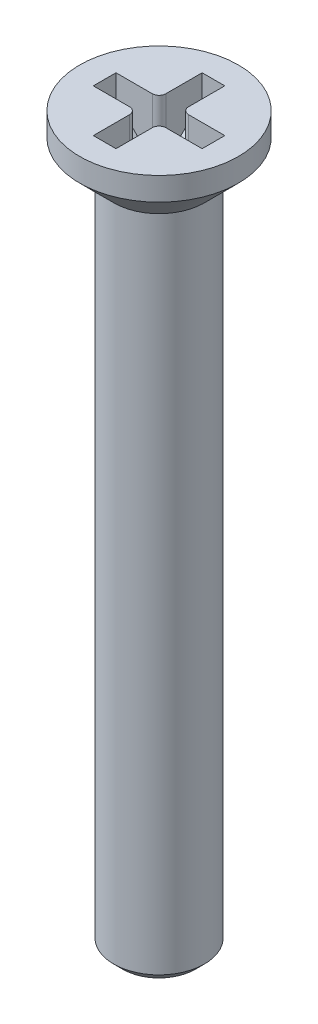
ISO-10303-21;
HEADER;
FILE_DESCRIPTION(('STEP AP214'),'2;1');
FILE_NAME('part.step','',(''),(''),'','','');
FILE_SCHEMA(('AUTOMOTIVE_DESIGN { 1 0 10303 214 1 1 1 1 }'));
ENDSEC;
DATA;
#1=APPLICATION_CONTEXT('core data for automotive mechanical design processes');
#2=APPLICATION_PROTOCOL_DEFINITION('international standard','automotive_design',2000,#1);
#3=PRODUCT_CONTEXT('',#1,'mechanical');
#4=PRODUCT('Part','Part','',(#3));
#5=PRODUCT_RELATED_PRODUCT_CATEGORY('part','',(#4));
#6=PRODUCT_DEFINITION_FORMATION('','',#4);
#7=PRODUCT_DEFINITION_CONTEXT('part definition',#1,'design');
#8=PRODUCT_DEFINITION('design','',#6,#7);
#9=PRODUCT_DEFINITION_SHAPE('','',#8);
#10=(LENGTH_UNIT() NAMED_UNIT(*) SI_UNIT(.MILLI.,.METRE.));
#11=(NAMED_UNIT(*) PLANE_ANGLE_UNIT() SI_UNIT($,.RADIAN.));
#12=(NAMED_UNIT(*) SI_UNIT($,.STERADIAN.) SOLID_ANGLE_UNIT());
#13=UNCERTAINTY_MEASURE_WITH_UNIT(LENGTH_MEASURE(1.E-05),#10,'distance_accuracy_value','');
#14=(GEOMETRIC_REPRESENTATION_CONTEXT(3) GLOBAL_UNCERTAINTY_ASSIGNED_CONTEXT((#13)) GLOBAL_UNIT_ASSIGNED_CONTEXT((#10,
#11,#12)) REPRESENTATION_CONTEXT('',''));
#15=CARTESIAN_POINT('',(0.,0.,0.));
#16=DIRECTION('',(0.,0.,1.));
#17=DIRECTION('',(1.,0.,0.));
#18=AXIS2_PLACEMENT_3D('',#15,#16,#17);
#19=CARTESIAN_POINT('',(0.,2.68965981119297,0.));
#20=DIRECTION('',(0.,-1.,0.));
#21=DIRECTION('',(0.,0.,-1.));
#22=AXIS2_PLACEMENT_3D('',#19,#20,#21);
#23=PLANE('',#22);
#24=DIRECTION('',(0.,0.,-1.));
#25=VECTOR('',#24,1.);
#26=CARTESIAN_POINT('',(0.25,2.68965981119297,-1.2));
#27=LINE('',#26,#25);
#28=CARTESIAN_POINT('',(0.25,2.68965981119297,-0.399999999999998));
#29=VERTEX_POINT('',#28);
#30=CARTESIAN_POINT('',(0.25,2.68965981119297,-1.2));
#31=VERTEX_POINT('',#30);
#32=EDGE_CURVE('E279',#29,#31,#27,.T.);
#33=ORIENTED_EDGE('',*,*,#32,.F.);
#34=CARTESIAN_POINT('',(0.4,2.68965981119297,-0.399999999999999));
#35=DIRECTION('',(0.,-1.,0.));
#36=DIRECTION('',(0.,0.,-1.));
#37=AXIS2_PLACEMENT_3D('',#34,#35,#36);
#38=CIRCLE('',#37,0.15);
#39=CARTESIAN_POINT('',(0.4,2.68965981119297,-0.249999999999999));
#40=VERTEX_POINT('',#39);
#41=EDGE_CURVE('E311',#29,#40,#38,.F.);
#42=ORIENTED_EDGE('',*,*,#41,.T.);
#43=DIRECTION('',(-1.,0.,0.));
#44=VECTOR('',#43,1.);
#45=CARTESIAN_POINT('',(1.2,2.68965981119297,-0.249999999999996));
#46=LINE('',#45,#44);
#47=CARTESIAN_POINT('',(1.2,2.68965981119297,-0.249999999999996));
#48=VERTEX_POINT('',#47);
#49=EDGE_CURVE('E249',#48,#40,#46,.T.);
#50=ORIENTED_EDGE('',*,*,#49,.F.);
#51=DIRECTION('',(0.,0.,-1.));
#52=VECTOR('',#51,1.);
#53=CARTESIAN_POINT('',(1.2,2.68965981119297,0.250000000000004));
#54=LINE('',#53,#52);
#55=CARTESIAN_POINT('',(1.2,2.68965981119297,0.250000000000004));
#56=VERTEX_POINT('',#55);
#57=EDGE_CURVE('E248',#56,#48,#54,.T.);
#58=ORIENTED_EDGE('',*,*,#57,.F.);
#59=DIRECTION('',(1.,0.,0.));
#60=VECTOR('',#59,1.);
#61=CARTESIAN_POINT('',(1.2,2.68965981119297,0.250000000000004));
#62=LINE('',#61,#60);
#63=CARTESIAN_POINT('',(0.4,2.68965981119297,0.250000000000001));
#64=VERTEX_POINT('',#63);
#65=EDGE_CURVE('E252',#64,#56,#62,.T.);
#66=ORIENTED_EDGE('',*,*,#65,.F.);
#67=CARTESIAN_POINT('',(0.4,2.68965981119297,0.400000000000001));
#68=DIRECTION('',(0.,-1.,0.));
#69=DIRECTION('',(0.,0.,-1.));
#70=AXIS2_PLACEMENT_3D('',#67,#68,#69);
#71=CIRCLE('',#70,0.15);
#72=CARTESIAN_POINT('',(0.25,2.68965981119297,0.400000000000001));
#73=VERTEX_POINT('',#72);
#74=EDGE_CURVE('E309',#64,#73,#71,.F.);
#75=ORIENTED_EDGE('',*,*,#74,.T.);
#76=DIRECTION('',(0.,0.,-1.));
#77=VECTOR('',#76,1.);
#78=CARTESIAN_POINT('',(0.25,2.68965981119297,1.2));
#79=LINE('',#78,#77);
#80=CARTESIAN_POINT('',(0.25,2.68965981119297,1.2));
#81=VERTEX_POINT('',#80);
#82=EDGE_CURVE('E226',#81,#73,#79,.T.);
#83=ORIENTED_EDGE('',*,*,#82,.F.);
#84=DIRECTION('',(1.,0.,0.));
#85=VECTOR('',#84,1.);
#86=CARTESIAN_POINT('',(-0.25,2.68965981119297,1.2));
#87=LINE('',#86,#85);
#88=CARTESIAN_POINT('',(-0.25,2.68965981119297,1.2));
#89=VERTEX_POINT('',#88);
#90=EDGE_CURVE('E232',#89,#81,#87,.T.);
#91=ORIENTED_EDGE('',*,*,#90,.F.);
#92=DIRECTION('',(0.,0.,1.));
#93=VECTOR('',#92,1.);
#94=CARTESIAN_POINT('',(-0.25,2.68965981119297,1.2));
#95=LINE('',#94,#93);
#96=CARTESIAN_POINT('',(-0.25,2.68965981119297,0.399999999999996));
#97=VERTEX_POINT('',#96);
#98=EDGE_CURVE('E235',#97,#89,#95,.T.);
#99=ORIENTED_EDGE('',*,*,#98,.F.);
#100=CARTESIAN_POINT('',(-0.4,2.68965981119297,0.399999999999996));
#101=DIRECTION('',(0.,-1.,0.));
#102=DIRECTION('',(0.,0.,-1.));
#103=AXIS2_PLACEMENT_3D('',#100,#101,#102);
#104=CIRCLE('',#103,0.15);
#105=CARTESIAN_POINT('',(-0.399999999999998,2.68965981119297,0.249999999999996));
#106=VERTEX_POINT('',#105);
#107=EDGE_CURVE('E305',#97,#106,#104,.F.);
#108=ORIENTED_EDGE('',*,*,#107,.T.);
#109=DIRECTION('',(1.,0.,0.));
#110=VECTOR('',#109,1.);
#111=CARTESIAN_POINT('',(-1.2,2.68965981119297,0.249999999999988));
#112=LINE('',#111,#110);
#113=CARTESIAN_POINT('',(-1.2,2.68965981119297,0.249999999999988));
#114=VERTEX_POINT('',#113);
#115=EDGE_CURVE('E217',#114,#106,#112,.T.);
#116=ORIENTED_EDGE('',*,*,#115,.F.);
#117=DIRECTION('',(0.,0.,1.));
#118=VECTOR('',#117,1.);
#119=CARTESIAN_POINT('',(-1.2,2.68965981119297,-0.250000000000012));
#120=LINE('',#119,#118);
#121=CARTESIAN_POINT('',(-1.2,2.68965981119297,-0.250000000000012));
#122=VERTEX_POINT('',#121);
#123=EDGE_CURVE('E220',#122,#114,#120,.T.);
#124=ORIENTED_EDGE('',*,*,#123,.F.);
#125=CARTESIAN_POINT('',(-0.4,2.68965981119297,-0.250000000000001));
#126=VERTEX_POINT('',#125);
#127=EDGE_CURVE('E241',#126,#122,#46,.T.);
#128=ORIENTED_EDGE('',*,*,#127,.F.);
#129=CARTESIAN_POINT('',(-0.4,2.68965981119297,-0.400000000000001));
#130=DIRECTION('',(0.,-1.,0.));
#131=DIRECTION('',(0.,0.,-1.));
#132=AXIS2_PLACEMENT_3D('',#129,#130,#131);
#133=CIRCLE('',#132,0.15);
#134=CARTESIAN_POINT('',(-0.25,2.68965981119297,-0.400000000000001));
#135=VERTEX_POINT('',#134);
#136=EDGE_CURVE('E307',#126,#135,#133,.F.);
#137=ORIENTED_EDGE('',*,*,#136,.T.);
#138=DIRECTION('',(0.,0.,1.));
#139=VECTOR('',#138,1.);
#140=CARTESIAN_POINT('',(-0.25,2.68965981119297,-1.2));
#141=LINE('',#140,#139);
#142=CARTESIAN_POINT('',(-0.25,2.68965981119297,-1.2));
#143=VERTEX_POINT('',#142);
#144=EDGE_CURVE('E271',#143,#135,#141,.T.);
#145=ORIENTED_EDGE('',*,*,#144,.F.);
#146=DIRECTION('',(-1.,0.,0.));
#147=VECTOR('',#146,1.);
#148=CARTESIAN_POINT('',(0.25,2.68965981119297,-1.2));
#149=LINE('',#148,#147);
#150=EDGE_CURVE('E276',#31,#143,#149,.T.);
#151=ORIENTED_EDGE('',*,*,#150,.F.);
#152=EDGE_LOOP('',(#33,#42,#50,#58,#66,#75,#83,#91,#99,#108,#116,#124,#128,#137,#145,#151));
#153=FACE_BOUND('',#152,.T.);
#154=CARTESIAN_POINT('',(0.,2.68965981119297,0.));
#155=DIRECTION('',(0.,-1.,0.));
#156=DIRECTION('',(0.,0.,-1.));
#157=AXIS2_PLACEMENT_3D('',#154,#155,#156);
#158=CIRCLE('',#157,1.75);
#159=CARTESIAN_POINT('',(0.,2.68965981119297,-1.75));
#160=VERTEX_POINT('',#159);
#161=EDGE_CURVE('E299',#160,#160,#158,.T.);
#162=ORIENTED_EDGE('',*,*,#161,.F.);
#163=EDGE_LOOP('',(#162));
#164=FACE_BOUND('',#163,.T.);
#165=ADVANCED_FACE('F35',(#153,#164),#23,.F.);
#166=CARTESIAN_POINT('',(0.,-3.76919896922529,0.));
#167=DIRECTION('',(0.,-1.,0.));
#168=DIRECTION('',(0.,0.,-1.));
#169=AXIS2_PLACEMENT_3D('',#166,#167,#168);
#170=CYLINDRICAL_SURFACE('',#169,1.75);
#171=CARTESIAN_POINT('',(0.,2.17965981119297,0.));
#172=DIRECTION('',(0.,-1.,0.));
#173=DIRECTION('',(0.,0.,-1.));
#174=AXIS2_PLACEMENT_3D('',#171,#172,#173);
#175=CIRCLE('',#174,1.75);
#176=CARTESIAN_POINT('',(0.,2.17965981119297,-1.75));
#177=VERTEX_POINT('',#176);
#178=EDGE_CURVE('E296',#177,#177,#175,.T.);
#179=ORIENTED_EDGE('',*,*,#178,.F.);
#180=EDGE_LOOP('',(#179));
#181=FACE_BOUND('',#180,.T.);
#182=ORIENTED_EDGE('',*,*,#161,.T.);
#183=EDGE_LOOP('',(#182));
#184=FACE_BOUND('',#183,.T.);
#185=ADVANCED_FACE('F373',(#181,#184),#170,.T.);
#186=CARTESIAN_POINT('',(0.,2.17965981119297,0.));
#187=DIRECTION('',(0.,1.,0.));
#188=DIRECTION('',(0.,0.,1.));
#189=AXIS2_PLACEMENT_3D('',#186,#187,#188);
#190=CONICAL_SURFACE('',#189,1.75,0.785398163397451);
#191=CARTESIAN_POINT('',(0.,1.42965981119297,0.));
#192=DIRECTION('',(0.,-1.,0.));
#193=DIRECTION('',(0.,0.,-1.));
#194=AXIS2_PLACEMENT_3D('',#191,#192,#193);
#195=CIRCLE('',#194,1.);
#196=CARTESIAN_POINT('',(0.,1.42965981119297,-1.));
#197=VERTEX_POINT('',#196);
#198=EDGE_CURVE('E293',#197,#197,#195,.T.);
#199=ORIENTED_EDGE('',*,*,#198,.F.);
#200=EDGE_LOOP('',(#199));
#201=FACE_BOUND('',#200,.T.);
#202=ORIENTED_EDGE('',*,*,#178,.T.);
#203=EDGE_LOOP('',(#202));
#204=FACE_BOUND('',#203,.T.);
#205=ADVANCED_FACE('F378',(#201,#204),#190,.T.);
#206=CARTESIAN_POINT('',(0.,-3.76919896922529,0.));
#207=DIRECTION('',(0.,-1.,0.));
#208=DIRECTION('',(0.,0.,-1.));
#209=AXIS2_PLACEMENT_3D('',#206,#207,#208);
#210=CYLINDRICAL_SURFACE('',#209,0.999999999999999);
#211=CARTESIAN_POINT('',(0.,-13.110340188807,0.));
#212=DIRECTION('',(0.,-1.,0.));
#213=DIRECTION('',(0.,0.,-1.));
#214=AXIS2_PLACEMENT_3D('',#211,#212,#213);
#215=CIRCLE('',#214,0.999999999999998);
#216=CARTESIAN_POINT('',(0.,-13.110340188807,-0.999999999999998));
#217=VERTEX_POINT('',#216);
#218=EDGE_CURVE('E290',#217,#217,#215,.T.);
#219=ORIENTED_EDGE('',*,*,#218,.F.);
#220=EDGE_LOOP('',(#219));
#221=FACE_BOUND('',#220,.T.);
#222=ORIENTED_EDGE('',*,*,#198,.T.);
#223=EDGE_LOOP('',(#222));
#224=FACE_BOUND('',#223,.T.);
#225=ADVANCED_FACE('F558',(#221,#224),#210,.T.);
#226=CARTESIAN_POINT('',(0.,-13.110340188807,0.));
#227=DIRECTION('',(0.,1.,0.));
#228=DIRECTION('',(0.,0.,1.));
#229=AXIS2_PLACEMENT_3D('',#226,#227,#228);
#230=CONICAL_SURFACE('',#229,0.999999999999998,0.785398163397447);
#231=CARTESIAN_POINT('',(0.,-13.310340188807,0.));
#232=DIRECTION('',(0.,-1.,0.));
#233=DIRECTION('',(0.,0.,-1.));
#234=AXIS2_PLACEMENT_3D('',#231,#232,#233);
#235=CIRCLE('',#234,0.8);
#236=CARTESIAN_POINT('',(0.,-13.310340188807,-0.8));
#237=VERTEX_POINT('',#236);
#238=EDGE_CURVE('E285',#237,#237,#235,.T.);
#239=ORIENTED_EDGE('',*,*,#238,.F.);
#240=EDGE_LOOP('',(#239));
#241=FACE_BOUND('',#240,.T.);
#242=ORIENTED_EDGE('',*,*,#218,.T.);
#243=EDGE_LOOP('',(#242));
#244=FACE_BOUND('',#243,.T.);
#245=ADVANCED_FACE('F566',(#241,#244),#230,.T.);
#246=CARTESIAN_POINT('',(-0.8,-13.310340188807,0.));
#247=DIRECTION('',(0.,1.,0.));
#248=DIRECTION('',(0.,0.,1.));
#249=AXIS2_PLACEMENT_3D('',#246,#247,#248);
#250=PLANE('',#249);
#251=ORIENTED_EDGE('',*,*,#238,.T.);
#252=EDGE_LOOP('',(#251));
#253=FACE_BOUND('',#252,.T.);
#254=ADVANCED_FACE('F535',(#253),#250,.F.);
#255=CARTESIAN_POINT('',(-0.25,2.18965981119297,-1.2));
#256=DIRECTION('',(-1.,0.,0.));
#257=DIRECTION('',(0.,0.,1.));
#258=AXIS2_PLACEMENT_3D('',#255,#256,#257);
#259=PLANE('',#258);
#260=ORIENTED_EDGE('',*,*,#144,.T.);
#261=DIRECTION('',(0.,-1.,0.));
#262=VECTOR('',#261,1.);
#263=CARTESIAN_POINT('',(-0.25,2.18965981119297,-0.400000000000001));
#264=LINE('',#263,#262);
#265=CARTESIAN_POINT('',(-0.25,1.42965981119297,-0.400000000000001));
#266=VERTEX_POINT('',#265);
#267=EDGE_CURVE('E320',#135,#266,#264,.T.);
#268=ORIENTED_EDGE('',*,*,#267,.T.);
#269=DIRECTION('',(0.,0.,-1.));
#270=VECTOR('',#269,1.);
#271=CARTESIAN_POINT('',(-0.25,1.42965981119297,0.));
#272=LINE('',#271,#270);
#273=CARTESIAN_POINT('',(-0.25,1.42965981119297,-0.439999999999998));
#274=VERTEX_POINT('',#273);
#275=EDGE_CURVE('E258',#266,#274,#272,.T.);
#276=ORIENTED_EDGE('',*,*,#275,.T.);
#277=DIRECTION('',(0.,0.707106781186547,-0.707106781186548));
#278=VECTOR('',#277,1.);
#279=CARTESIAN_POINT('',(-0.25,1.42965981119297,-0.439999999999998));
#280=LINE('',#279,#278);
#281=CARTESIAN_POINT('',(-0.25,2.18965981119297,-1.2));
#282=VERTEX_POINT('',#281);
#283=EDGE_CURVE('E264',#274,#282,#280,.T.);
#284=ORIENTED_EDGE('',*,*,#283,.T.);
#285=DIRECTION('',(0.,1.,0.));
#286=VECTOR('',#285,1.);
#287=CARTESIAN_POINT('',(-0.25,2.18965981119297,-1.2));
#288=LINE('',#287,#286);
#289=EDGE_CURVE('E283',#282,#143,#288,.T.);
#290=ORIENTED_EDGE('',*,*,#289,.T.);
#291=EDGE_LOOP('',(#260,#268,#276,#284,#290));
#292=FACE_BOUND('',#291,.T.);
#293=ADVANCED_FACE('F532',(#292),#259,.F.);
#294=CARTESIAN_POINT('',(0.25,2.18965981119297,-1.2));
#295=DIRECTION('',(0.,0.,-1.));
#296=DIRECTION('',(-1.,0.,0.));
#297=AXIS2_PLACEMENT_3D('',#294,#295,#296);
#298=PLANE('',#297);
#299=ORIENTED_EDGE('',*,*,#150,.T.);
#300=ORIENTED_EDGE('',*,*,#289,.F.);
#301=DIRECTION('',(-1.,0.,0.));
#302=VECTOR('',#301,1.);
#303=CARTESIAN_POINT('',(0.25,2.18965981119297,-1.2));
#304=LINE('',#303,#302);
#305=CARTESIAN_POINT('',(0.25,2.18965981119297,-1.2));
#306=VERTEX_POINT('',#305);
#307=EDGE_CURVE('E272',#306,#282,#304,.T.);
#308=ORIENTED_EDGE('',*,*,#307,.F.);
#309=DIRECTION('',(0.,1.,0.));
#310=VECTOR('',#309,1.);
#311=CARTESIAN_POINT('',(0.25,2.18965981119297,-1.2));
#312=LINE('',#311,#310);
#313=EDGE_CURVE('E275',#306,#31,#312,.T.);
#314=ORIENTED_EDGE('',*,*,#313,.T.);
#315=EDGE_LOOP('',(#299,#300,#308,#314));
#316=FACE_BOUND('',#315,.T.);
#317=ADVANCED_FACE('F522',(#316),#298,.F.);
#318=CARTESIAN_POINT('',(0.25,2.18965981119297,-1.2));
#319=DIRECTION('',(1.,0.,0.));
#320=DIRECTION('',(0.,0.,-1.));
#321=AXIS2_PLACEMENT_3D('',#318,#319,#320);
#322=PLANE('',#321);
#323=DIRECTION('',(0.,0.,-1.));
#324=VECTOR('',#323,1.);
#325=CARTESIAN_POINT('',(0.25,1.42965981119297,0.));
#326=LINE('',#325,#324);
#327=CARTESIAN_POINT('',(0.25,1.42965981119297,-0.399999999999999));
#328=VERTEX_POINT('',#327);
#329=CARTESIAN_POINT('',(0.25,1.42965981119297,-0.439999999999998));
#330=VERTEX_POINT('',#329);
#331=EDGE_CURVE('E261',#328,#330,#326,.T.);
#332=ORIENTED_EDGE('',*,*,#331,.F.);
#333=DIRECTION('',(0.,1.,0.));
#334=VECTOR('',#333,1.);
#335=CARTESIAN_POINT('',(0.25,2.18965981119297,-0.399999999999998));
#336=LINE('',#335,#334);
#337=EDGE_CURVE('E302',#328,#29,#336,.T.);
#338=ORIENTED_EDGE('',*,*,#337,.T.);
#339=ORIENTED_EDGE('',*,*,#32,.T.);
#340=ORIENTED_EDGE('',*,*,#313,.F.);
#341=DIRECTION('',(0.,0.707106781186547,-0.707106781186548));
#342=VECTOR('',#341,1.);
#343=CARTESIAN_POINT('',(0.25,1.42965981119297,-0.439999999999998));
#344=LINE('',#343,#342);
#345=EDGE_CURVE('E263',#330,#306,#344,.T.);
#346=ORIENTED_EDGE('',*,*,#345,.F.);
#347=EDGE_LOOP('',(#332,#338,#339,#340,#346));
#348=FACE_BOUND('',#347,.T.);
#349=ADVANCED_FACE('F512',(#348),#322,.F.);
#350=CARTESIAN_POINT('',(0.25,1.42965981119297,0.));
#351=DIRECTION('',(0.,1.,0.));
#352=DIRECTION('',(0.,0.,1.));
#353=AXIS2_PLACEMENT_3D('',#350,#351,#352);
#354=PLANE('',#353);
#355=ORIENTED_EDGE('',*,*,#275,.F.);
#356=CARTESIAN_POINT('',(-0.4,1.42965981119297,-0.400000000000001));
#357=DIRECTION('',(0.,1.,0.));
#358=DIRECTION('',(0.,0.,1.));
#359=AXIS2_PLACEMENT_3D('',#356,#357,#358);
#360=CIRCLE('',#359,0.15);
#361=CARTESIAN_POINT('',(-0.4,1.42965981119297,-0.250000000000001));
#362=VERTEX_POINT('',#361);
#363=EDGE_CURVE('E43',#266,#362,#360,.F.);
#364=ORIENTED_EDGE('',*,*,#363,.T.);
#365=DIRECTION('',(1.,0.,0.));
#366=VECTOR('',#365,1.);
#367=CARTESIAN_POINT('',(0.,1.42965981119297,-0.25));
#368=LINE('',#367,#366);
#369=CARTESIAN_POINT('',(-0.439999999999996,1.42965981119297,-0.250000000000005));
#370=VERTEX_POINT('',#369);
#371=EDGE_CURVE('E170',#370,#362,#368,.T.);
#372=ORIENTED_EDGE('',*,*,#371,.F.);
#373=DIRECTION('',(0.,0.,1.));
#374=VECTOR('',#373,1.);
#375=CARTESIAN_POINT('',(-0.439999999999996,1.42965981119297,-0.250000000000005));
#376=LINE('',#375,#374);
#377=CARTESIAN_POINT('',(-0.440000000000001,1.42965981119297,0.249999999999995));
#378=VERTEX_POINT('',#377);
#379=EDGE_CURVE('E174',#370,#378,#376,.T.);
#380=ORIENTED_EDGE('',*,*,#379,.T.);
#381=DIRECTION('',(-1.,0.,0.));
#382=VECTOR('',#381,1.);
#383=CARTESIAN_POINT('',(0.,1.42965981119297,0.25));
#384=LINE('',#383,#382);
#385=CARTESIAN_POINT('',(-0.399999999999999,1.42965981119297,0.249999999999996));
#386=VERTEX_POINT('',#385);
#387=EDGE_CURVE('E195',#386,#378,#384,.T.);
#388=ORIENTED_EDGE('',*,*,#387,.F.);
#389=CARTESIAN_POINT('',(-0.4,1.42965981119297,0.399999999999996));
#390=DIRECTION('',(0.,1.,0.));
#391=DIRECTION('',(0.,0.,1.));
#392=AXIS2_PLACEMENT_3D('',#389,#390,#391);
#393=CIRCLE('',#392,0.15);
#394=CARTESIAN_POINT('',(-0.25,1.42965981119297,0.399999999999996));
#395=VERTEX_POINT('',#394);
#396=EDGE_CURVE('E11',#386,#395,#393,.F.);
#397=ORIENTED_EDGE('',*,*,#396,.T.);
#398=DIRECTION('',(0.,0.,1.));
#399=VECTOR('',#398,1.);
#400=CARTESIAN_POINT('',(-0.25,1.42965981119297,0.));
#401=LINE('',#400,#399);
#402=CARTESIAN_POINT('',(-0.25,1.42965981119297,0.439999999999998));
#403=VERTEX_POINT('',#402);
#404=EDGE_CURVE('E199',#395,#403,#401,.T.);
#405=ORIENTED_EDGE('',*,*,#404,.T.);
#406=DIRECTION('',(1.,0.,0.));
#407=VECTOR('',#406,1.);
#408=CARTESIAN_POINT('',(-0.25,1.42965981119297,0.439999999999998));
#409=LINE('',#408,#407);
#410=CARTESIAN_POINT('',(0.25,1.42965981119297,0.439999999999998));
#411=VERTEX_POINT('',#410);
#412=EDGE_CURVE('E204',#403,#411,#409,.T.);
#413=ORIENTED_EDGE('',*,*,#412,.T.);
#414=DIRECTION('',(0.,0.,1.));
#415=VECTOR('',#414,1.);
#416=CARTESIAN_POINT('',(0.25,1.42965981119297,0.));
#417=LINE('',#416,#415);
#418=CARTESIAN_POINT('',(0.25,1.42965981119297,0.400000000000001));
#419=VERTEX_POINT('',#418);
#420=EDGE_CURVE('E188',#419,#411,#417,.T.);
#421=ORIENTED_EDGE('',*,*,#420,.F.);
#422=CARTESIAN_POINT('',(0.4,1.42965981119297,0.400000000000001));
#423=DIRECTION('',(0.,1.,0.));
#424=DIRECTION('',(0.,0.,1.));
#425=AXIS2_PLACEMENT_3D('',#422,#423,#424);
#426=CIRCLE('',#425,0.15);
#427=CARTESIAN_POINT('',(0.4,1.42965981119297,0.250000000000001));
#428=VERTEX_POINT('',#427);
#429=EDGE_CURVE('E331',#419,#428,#426,.F.);
#430=ORIENTED_EDGE('',*,*,#429,.T.);
#431=DIRECTION('',(1.,0.,0.));
#432=VECTOR('',#431,1.);
#433=CARTESIAN_POINT('',(0.,1.42965981119297,0.25));
#434=LINE('',#433,#432);
#435=CARTESIAN_POINT('',(0.439999999999997,1.42965981119297,0.250000000000001));
#436=VERTEX_POINT('',#435);
#437=EDGE_CURVE('E209',#428,#436,#434,.T.);
#438=ORIENTED_EDGE('',*,*,#437,.T.);
#439=DIRECTION('',(0.,0.,-1.));
#440=VECTOR('',#439,1.);
#441=CARTESIAN_POINT('',(0.439999999999997,1.42965981119297,0.250000000000001));
#442=LINE('',#441,#440);
#443=CARTESIAN_POINT('',(0.439999999999999,1.42965981119297,-0.249999999999999));
#444=VERTEX_POINT('',#443);
#445=EDGE_CURVE('E212',#436,#444,#442,.T.);
#446=ORIENTED_EDGE('',*,*,#445,.T.);
#447=CARTESIAN_POINT('',(0.4,1.42965981119297,-0.249999999999999));
#448=VERTEX_POINT('',#447);
#449=EDGE_CURVE('E180',#448,#444,#368,.T.);
#450=ORIENTED_EDGE('',*,*,#449,.F.);
#451=CARTESIAN_POINT('',(0.4,1.42965981119297,-0.399999999999999));
#452=DIRECTION('',(0.,1.,0.));
#453=DIRECTION('',(0.,0.,1.));
#454=AXIS2_PLACEMENT_3D('',#451,#452,#453);
#455=CIRCLE('',#454,0.15);
#456=EDGE_CURVE('E329',#448,#328,#455,.F.);
#457=ORIENTED_EDGE('',*,*,#456,.T.);
#458=ORIENTED_EDGE('',*,*,#331,.T.);
#459=DIRECTION('',(-1.,0.,0.));
#460=VECTOR('',#459,1.);
#461=CARTESIAN_POINT('',(0.25,1.42965981119297,-0.439999999999998));
#462=LINE('',#461,#460);
#463=EDGE_CURVE('E266',#330,#274,#462,.T.);
#464=ORIENTED_EDGE('',*,*,#463,.T.);
#465=EDGE_LOOP('',(#355,#364,#372,#380,#388,#397,#405,#413,#421,#430,#438,#446,#450,#457,#458,#464));
#466=FACE_BOUND('',#465,.T.);
#467=ADVANCED_FACE('F173',(#466),#354,.T.);
#468=CARTESIAN_POINT('',(0.25,1.42965981119297,-0.439999999999998));
#469=DIRECTION('',(0.,0.707106781186548,0.707106781186547));
#470=DIRECTION('',(0.,-0.707106781186547,0.707106781186548));
#471=AXIS2_PLACEMENT_3D('',#468,#469,#470);
#472=PLANE('',#471);
#473=ORIENTED_EDGE('',*,*,#283,.F.);
#474=ORIENTED_EDGE('',*,*,#463,.F.);
#475=ORIENTED_EDGE('',*,*,#345,.T.);
#476=ORIENTED_EDGE('',*,*,#307,.T.);
#477=EDGE_LOOP('',(#473,#474,#475,#476));
#478=FACE_BOUND('',#477,.T.);
#479=ADVANCED_FACE('F502',(#478),#472,.T.);
#480=CARTESIAN_POINT('',(1.2,2.18965981119297,-0.249999999999996));
#481=DIRECTION('',(0.,0.,-1.));
#482=DIRECTION('',(-1.,0.,0.));
#483=AXIS2_PLACEMENT_3D('',#480,#481,#482);
#484=PLANE('',#483);
#485=ORIENTED_EDGE('',*,*,#371,.T.);
#486=DIRECTION('',(0.,-1.,0.));
#487=VECTOR('',#486,1.);
#488=CARTESIAN_POINT('',(-0.4,2.18965981119297,-0.250000000000001));
#489=LINE('',#488,#487);
#490=EDGE_CURVE('E323',#362,#126,#489,.F.);
#491=ORIENTED_EDGE('',*,*,#490,.T.);
#492=ORIENTED_EDGE('',*,*,#127,.T.);
#493=DIRECTION('',(0.,1.,0.));
#494=VECTOR('',#493,1.);
#495=CARTESIAN_POINT('',(-1.2,2.18965981119297,-0.250000000000012));
#496=LINE('',#495,#494);
#497=CARTESIAN_POINT('',(-1.2,2.18965981119297,-0.250000000000012));
#498=VERTEX_POINT('',#497);
#499=EDGE_CURVE('E192',#498,#122,#496,.T.);
#500=ORIENTED_EDGE('',*,*,#499,.F.);
#501=DIRECTION('',(-0.707106781186548,0.707106781186547,0.));
#502=VECTOR('',#501,1.);
#503=CARTESIAN_POINT('',(-0.439999999999996,1.42965981119297,-0.250000000000005));
#504=LINE('',#503,#502);
#505=EDGE_CURVE('E185',#370,#498,#504,.T.);
#506=ORIENTED_EDGE('',*,*,#505,.F.);
#507=EDGE_LOOP('',(#485,#491,#492,#500,#506));
#508=FACE_BOUND('',#507,.T.);
#509=ADVANCED_FACE('F190',(#508),#484,.F.);
#510=ORIENTED_EDGE('',*,*,#49,.T.);
#511=DIRECTION('',(0.,1.,0.));
#512=VECTOR('',#511,1.);
#513=CARTESIAN_POINT('',(0.4,2.18965981119297,-0.249999999999999));
#514=LINE('',#513,#512);
#515=EDGE_CURVE('E313',#40,#448,#514,.F.);
#516=ORIENTED_EDGE('',*,*,#515,.T.);
#517=ORIENTED_EDGE('',*,*,#449,.T.);
#518=DIRECTION('',(0.707106781186548,0.707106781186547,0.));
#519=VECTOR('',#518,1.);
#520=CARTESIAN_POINT('',(0.439999999999999,1.42965981119297,-0.249999999999999));
#521=LINE('',#520,#519);
#522=CARTESIAN_POINT('',(1.2,2.18965981119297,-0.249999999999996));
#523=VERTEX_POINT('',#522);
#524=EDGE_CURVE('E179',#444,#523,#521,.T.);
#525=ORIENTED_EDGE('',*,*,#524,.T.);
#526=DIRECTION('',(0.,1.,0.));
#527=VECTOR('',#526,1.);
#528=CARTESIAN_POINT('',(1.2,2.18965981119297,-0.249999999999996));
#529=LINE('',#528,#527);
#530=EDGE_CURVE('E256',#523,#48,#529,.T.);
#531=ORIENTED_EDGE('',*,*,#530,.T.);
#532=EDGE_LOOP('',(#510,#516,#517,#525,#531));
#533=FACE_BOUND('',#532,.T.);
#534=ADVANCED_FACE('F484',(#533),#484,.F.);
#535=CARTESIAN_POINT('',(1.2,2.18965981119297,0.250000000000004));
#536=DIRECTION('',(1.,0.,0.));
#537=DIRECTION('',(0.,0.,-1.));
#538=AXIS2_PLACEMENT_3D('',#535,#536,#537);
#539=PLANE('',#538);
#540=ORIENTED_EDGE('',*,*,#57,.T.);
#541=ORIENTED_EDGE('',*,*,#530,.F.);
#542=DIRECTION('',(0.,0.,-1.));
#543=VECTOR('',#542,1.);
#544=CARTESIAN_POINT('',(1.2,2.18965981119297,0.250000000000004));
#545=LINE('',#544,#543);
#546=CARTESIAN_POINT('',(1.2,2.18965981119297,0.250000000000004));
#547=VERTEX_POINT('',#546);
#548=EDGE_CURVE('E244',#547,#523,#545,.T.);
#549=ORIENTED_EDGE('',*,*,#548,.F.);
#550=DIRECTION('',(0.,1.,0.));
#551=VECTOR('',#550,1.);
#552=CARTESIAN_POINT('',(1.2,2.18965981119297,0.250000000000004));
#553=LINE('',#552,#551);
#554=EDGE_CURVE('E247',#547,#56,#553,.T.);
#555=ORIENTED_EDGE('',*,*,#554,.T.);
#556=EDGE_LOOP('',(#540,#541,#549,#555));
#557=FACE_BOUND('',#556,.T.);
#558=ADVANCED_FACE('F477',(#557),#539,.F.);
#559=CARTESIAN_POINT('',(1.2,2.18965981119297,0.250000000000004));
#560=DIRECTION('',(0.,0.,1.));
#561=DIRECTION('',(1.,0.,0.));
#562=AXIS2_PLACEMENT_3D('',#559,#560,#561);
#563=PLANE('',#562);
#564=ORIENTED_EDGE('',*,*,#437,.F.);
#565=DIRECTION('',(0.,1.,0.));
#566=VECTOR('',#565,1.);
#567=CARTESIAN_POINT('',(0.4,2.18965981119297,0.250000000000001));
#568=LINE('',#567,#566);
#569=EDGE_CURVE('E315',#428,#64,#568,.T.);
#570=ORIENTED_EDGE('',*,*,#569,.T.);
#571=ORIENTED_EDGE('',*,*,#65,.T.);
#572=ORIENTED_EDGE('',*,*,#554,.F.);
#573=DIRECTION('',(0.707106781186548,0.707106781186547,0.));
#574=VECTOR('',#573,1.);
#575=CARTESIAN_POINT('',(0.439999999999997,1.42965981119297,0.250000000000001));
#576=LINE('',#575,#574);
#577=EDGE_CURVE('E211',#436,#547,#576,.T.);
#578=ORIENTED_EDGE('',*,*,#577,.F.);
#579=EDGE_LOOP('',(#564,#570,#571,#572,#578));
#580=FACE_BOUND('',#579,.T.);
#581=ADVANCED_FACE('F341',(#580),#563,.F.);
#582=CARTESIAN_POINT('',(0.25,2.18965981119297,1.2));
#583=DIRECTION('',(1.,0.,0.));
#584=DIRECTION('',(0.,0.,-1.));
#585=AXIS2_PLACEMENT_3D('',#582,#583,#584);
#586=PLANE('',#585);
#587=ORIENTED_EDGE('',*,*,#82,.T.);
#588=DIRECTION('',(0.,1.,0.));
#589=VECTOR('',#588,1.);
#590=CARTESIAN_POINT('',(0.25,2.18965981119297,0.400000000000001));
#591=LINE('',#590,#589);
#592=EDGE_CURVE('E318',#73,#419,#591,.F.);
#593=ORIENTED_EDGE('',*,*,#592,.T.);
#594=ORIENTED_EDGE('',*,*,#420,.T.);
#595=DIRECTION('',(0.,0.707106781186547,0.707106781186548));
#596=VECTOR('',#595,1.);
#597=CARTESIAN_POINT('',(0.25,1.42965981119297,0.439999999999998));
#598=LINE('',#597,#596);
#599=CARTESIAN_POINT('',(0.25,2.18965981119297,1.2));
#600=VERTEX_POINT('',#599);
#601=EDGE_CURVE('E202',#411,#600,#598,.T.);
#602=ORIENTED_EDGE('',*,*,#601,.T.);
#603=DIRECTION('',(0.,1.,0.));
#604=VECTOR('',#603,1.);
#605=CARTESIAN_POINT('',(0.25,2.18965981119297,1.2));
#606=LINE('',#605,#604);
#607=EDGE_CURVE('E239',#600,#81,#606,.T.);
#608=ORIENTED_EDGE('',*,*,#607,.T.);
#609=EDGE_LOOP('',(#587,#593,#594,#602,#608));
#610=FACE_BOUND('',#609,.T.);
#611=ADVANCED_FACE('F352',(#610),#586,.F.);
#612=CARTESIAN_POINT('',(-0.25,2.18965981119297,1.2));
#613=DIRECTION('',(0.,0.,1.));
#614=DIRECTION('',(1.,0.,0.));
#615=AXIS2_PLACEMENT_3D('',#612,#613,#614);
#616=PLANE('',#615);
#617=ORIENTED_EDGE('',*,*,#90,.T.);
#618=ORIENTED_EDGE('',*,*,#607,.F.);
#619=DIRECTION('',(1.,0.,0.));
#620=VECTOR('',#619,1.);
#621=CARTESIAN_POINT('',(-0.25,2.18965981119297,1.2));
#622=LINE('',#621,#620);
#623=CARTESIAN_POINT('',(-0.25,2.18965981119297,1.2));
#624=VERTEX_POINT('',#623);
#625=EDGE_CURVE('E228',#624,#600,#622,.T.);
#626=ORIENTED_EDGE('',*,*,#625,.F.);
#627=DIRECTION('',(0.,1.,0.));
#628=VECTOR('',#627,1.);
#629=CARTESIAN_POINT('',(-0.25,2.18965981119297,1.2));
#630=LINE('',#629,#628);
#631=EDGE_CURVE('E231',#624,#89,#630,.T.);
#632=ORIENTED_EDGE('',*,*,#631,.T.);
#633=EDGE_LOOP('',(#617,#618,#626,#632));
#634=FACE_BOUND('',#633,.T.);
#635=ADVANCED_FACE('F357',(#634),#616,.F.);
#636=CARTESIAN_POINT('',(-0.25,2.18965981119297,1.2));
#637=DIRECTION('',(-1.,0.,0.));
#638=DIRECTION('',(0.,0.,1.));
#639=AXIS2_PLACEMENT_3D('',#636,#637,#638);
#640=PLANE('',#639);
#641=ORIENTED_EDGE('',*,*,#404,.F.);
#642=DIRECTION('',(0.,1.,0.));
#643=VECTOR('',#642,1.);
#644=CARTESIAN_POINT('',(-0.25,2.18965981119297,0.399999999999996));
#645=LINE('',#644,#643);
#646=EDGE_CURVE('E325',#395,#97,#645,.T.);
#647=ORIENTED_EDGE('',*,*,#646,.T.);
#648=ORIENTED_EDGE('',*,*,#98,.T.);
#649=ORIENTED_EDGE('',*,*,#631,.F.);
#650=DIRECTION('',(0.,0.707106781186547,0.707106781186548));
#651=VECTOR('',#650,1.);
#652=CARTESIAN_POINT('',(-0.25,1.42965981119297,0.439999999999998));
#653=LINE('',#652,#651);
#654=EDGE_CURVE('E201',#403,#624,#653,.T.);
#655=ORIENTED_EDGE('',*,*,#654,.F.);
#656=EDGE_LOOP('',(#641,#647,#648,#649,#655));
#657=FACE_BOUND('',#656,.T.);
#658=ADVANCED_FACE('F362',(#657),#640,.F.);
#659=CARTESIAN_POINT('',(-1.2,2.18965981119297,0.249999999999988));
#660=DIRECTION('',(0.,0.,1.));
#661=DIRECTION('',(1.,0.,0.));
#662=AXIS2_PLACEMENT_3D('',#659,#660,#661);
#663=PLANE('',#662);
#664=ORIENTED_EDGE('',*,*,#115,.T.);
#665=DIRECTION('',(0.,1.,0.));
#666=VECTOR('',#665,1.);
#667=CARTESIAN_POINT('',(-0.399999999999998,2.18965981119297,0.249999999999996));
#668=LINE('',#667,#666);
#669=EDGE_CURVE('E50',#106,#386,#668,.F.);
#670=ORIENTED_EDGE('',*,*,#669,.T.);
#671=ORIENTED_EDGE('',*,*,#387,.T.);
#672=DIRECTION('',(-0.707106781186548,0.707106781186547,0.));
#673=VECTOR('',#672,1.);
#674=CARTESIAN_POINT('',(-0.440000000000001,1.42965981119297,0.249999999999995));
#675=LINE('',#674,#673);
#676=CARTESIAN_POINT('',(-1.2,2.18965981119297,0.249999999999988));
#677=VERTEX_POINT('',#676);
#678=EDGE_CURVE('E187',#378,#677,#675,.T.);
#679=ORIENTED_EDGE('',*,*,#678,.T.);
#680=DIRECTION('',(0.,1.,0.));
#681=VECTOR('',#680,1.);
#682=CARTESIAN_POINT('',(-1.2,2.18965981119297,0.249999999999988));
#683=LINE('',#682,#681);
#684=EDGE_CURVE('E224',#677,#114,#683,.T.);
#685=ORIENTED_EDGE('',*,*,#684,.T.);
#686=EDGE_LOOP('',(#664,#670,#671,#679,#685));
#687=FACE_BOUND('',#686,.T.);
#688=ADVANCED_FACE('F439',(#687),#663,.F.);
#689=CARTESIAN_POINT('',(-1.2,2.18965981119297,-0.250000000000012));
#690=DIRECTION('',(-1.,0.,0.));
#691=DIRECTION('',(0.,0.,1.));
#692=AXIS2_PLACEMENT_3D('',#689,#690,#691);
#693=PLANE('',#692);
#694=ORIENTED_EDGE('',*,*,#123,.T.);
#695=ORIENTED_EDGE('',*,*,#684,.F.);
#696=DIRECTION('',(0.,0.,1.));
#697=VECTOR('',#696,1.);
#698=CARTESIAN_POINT('',(-1.2,2.18965981119297,-0.250000000000012));
#699=LINE('',#698,#697);
#700=EDGE_CURVE('E218',#498,#677,#699,.T.);
#701=ORIENTED_EDGE('',*,*,#700,.F.);
#702=ORIENTED_EDGE('',*,*,#499,.T.);
#703=EDGE_LOOP('',(#694,#695,#701,#702));
#704=FACE_BOUND('',#703,.T.);
#705=ADVANCED_FACE('F434',(#704),#693,.F.);
#706=CARTESIAN_POINT('',(0.439999999999997,1.42965981119297,0.250000000000001));
#707=DIRECTION('',(-0.707106781186547,0.707106781186548,0.));
#708=DIRECTION('',(-0.707106781186548,-0.707106781186547,0.));
#709=AXIS2_PLACEMENT_3D('',#706,#707,#708);
#710=PLANE('',#709);
#711=ORIENTED_EDGE('',*,*,#524,.F.);
#712=ORIENTED_EDGE('',*,*,#445,.F.);
#713=ORIENTED_EDGE('',*,*,#577,.T.);
#714=ORIENTED_EDGE('',*,*,#548,.T.);
#715=EDGE_LOOP('',(#711,#712,#713,#714));
#716=FACE_BOUND('',#715,.T.);
#717=ADVANCED_FACE('F425',(#716),#710,.T.);
#718=CARTESIAN_POINT('',(-0.25,1.42965981119297,0.439999999999998));
#719=DIRECTION('',(0.,0.707106781186548,-0.707106781186547));
#720=DIRECTION('',(0.,0.707106781186547,0.707106781186548));
#721=AXIS2_PLACEMENT_3D('',#718,#719,#720);
#722=PLANE('',#721);
#723=ORIENTED_EDGE('',*,*,#601,.F.);
#724=ORIENTED_EDGE('',*,*,#412,.F.);
#725=ORIENTED_EDGE('',*,*,#654,.T.);
#726=ORIENTED_EDGE('',*,*,#625,.T.);
#727=EDGE_LOOP('',(#723,#724,#725,#726));
#728=FACE_BOUND('',#727,.T.);
#729=ADVANCED_FACE('F417',(#728),#722,.T.);
#730=CARTESIAN_POINT('',(-0.439999999999996,1.42965981119297,-0.250000000000005));
#731=DIRECTION('',(0.707106781186547,0.707106781186548,0.));
#732=DIRECTION('',(-0.707106781186548,0.707106781186547,0.));
#733=AXIS2_PLACEMENT_3D('',#730,#731,#732);
#734=PLANE('',#733);
#735=ORIENTED_EDGE('',*,*,#678,.F.);
#736=ORIENTED_EDGE('',*,*,#379,.F.);
#737=ORIENTED_EDGE('',*,*,#505,.T.);
#738=ORIENTED_EDGE('',*,*,#700,.T.);
#739=EDGE_LOOP('',(#735,#736,#737,#738));
#740=FACE_BOUND('',#739,.T.);
#741=ADVANCED_FACE('F183',(#740),#734,.T.);
#742=CARTESIAN_POINT('',(0.4,2.18965981119297,-0.399999999999999));
#743=DIRECTION('',(0.,1.,0.));
#744=DIRECTION('',(0.,0.,1.));
#745=AXIS2_PLACEMENT_3D('',#742,#743,#744);
#746=CYLINDRICAL_SURFACE('',#745,0.15);
#747=ORIENTED_EDGE('',*,*,#456,.F.);
#748=ORIENTED_EDGE('',*,*,#515,.F.);
#749=ORIENTED_EDGE('',*,*,#41,.F.);
#750=ORIENTED_EDGE('',*,*,#337,.F.);
#751=EDGE_LOOP('',(#747,#748,#749,#750));
#752=FACE_BOUND('',#751,.T.);
#753=ADVANCED_FACE('F383',(#752),#746,.T.);
#754=CARTESIAN_POINT('',(0.4,2.18965981119297,0.400000000000001));
#755=DIRECTION('',(0.,1.,0.));
#756=DIRECTION('',(0.,0.,1.));
#757=AXIS2_PLACEMENT_3D('',#754,#755,#756);
#758=CYLINDRICAL_SURFACE('',#757,0.15);
#759=ORIENTED_EDGE('',*,*,#429,.F.);
#760=ORIENTED_EDGE('',*,*,#592,.F.);
#761=ORIENTED_EDGE('',*,*,#74,.F.);
#762=ORIENTED_EDGE('',*,*,#569,.F.);
#763=EDGE_LOOP('',(#759,#760,#761,#762));
#764=FACE_BOUND('',#763,.T.);
#765=ADVANCED_FACE('F344',(#764),#758,.T.);
#766=CARTESIAN_POINT('',(-0.4,2.18965981119297,-0.400000000000001));
#767=DIRECTION('',(0.,-1.,0.));
#768=DIRECTION('',(0.,0.,-1.));
#769=AXIS2_PLACEMENT_3D('',#766,#767,#768);
#770=CYLINDRICAL_SURFACE('',#769,0.15);
#771=ORIENTED_EDGE('',*,*,#136,.F.);
#772=ORIENTED_EDGE('',*,*,#490,.F.);
#773=ORIENTED_EDGE('',*,*,#363,.F.);
#774=ORIENTED_EDGE('',*,*,#267,.F.);
#775=EDGE_LOOP('',(#771,#772,#773,#774));
#776=FACE_BOUND('',#775,.T.);
#777=ADVANCED_FACE('F367',(#776),#770,.T.);
#778=CARTESIAN_POINT('',(-0.4,2.18965981119297,0.399999999999996));
#779=DIRECTION('',(0.,1.,0.));
#780=DIRECTION('',(0.,0.,1.));
#781=AXIS2_PLACEMENT_3D('',#778,#779,#780);
#782=CYLINDRICAL_SURFACE('',#781,0.15);
#783=ORIENTED_EDGE('',*,*,#396,.F.);
#784=ORIENTED_EDGE('',*,*,#669,.F.);
#785=ORIENTED_EDGE('',*,*,#107,.F.);
#786=ORIENTED_EDGE('',*,*,#646,.F.);
#787=EDGE_LOOP('',(#783,#784,#785,#786));
#788=FACE_BOUND('',#787,.T.);
#789=ADVANCED_FACE('F37',(#788),#782,.T.);
#790=CLOSED_SHELL('',(#165,#185,#205,#225,#245,#254,#293,#317,#349,#467,#479,#509,#534,#558,
#581,#611,#635,#658,#688,#705,#717,#729,#741,#753,#765,#777,#789));
#791=MANIFOLD_SOLID_BREP('B2',#790);
#792=ADVANCED_BREP_SHAPE_REPRESENTATION('',(#18,#791),#14);
#793=SHAPE_DEFINITION_REPRESENTATION(#9,#792);
ENDSEC;
END-ISO-10303-21;
